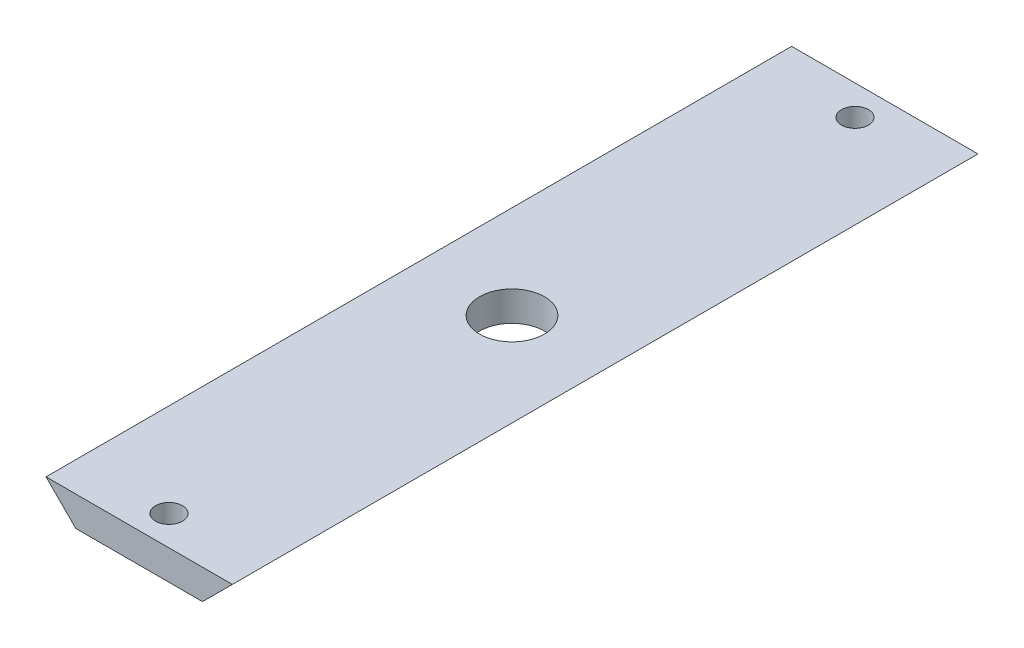
ISO-10303-21;
HEADER;
FILE_DESCRIPTION(('STEP AP214'),'2;1');
FILE_NAME('part.step','',(''),(''),'','','');
FILE_SCHEMA(('AUTOMOTIVE_DESIGN { 1 0 10303 214 1 1 1 1 }'));
ENDSEC;
DATA;
#1=APPLICATION_CONTEXT('core data for automotive mechanical design processes');
#2=APPLICATION_PROTOCOL_DEFINITION('international standard','automotive_design',2000,#1);
#3=PRODUCT_CONTEXT('',#1,'mechanical');
#4=PRODUCT('Part','Part','',(#3));
#5=PRODUCT_RELATED_PRODUCT_CATEGORY('part','',(#4));
#6=PRODUCT_DEFINITION_FORMATION('','',#4);
#7=PRODUCT_DEFINITION_CONTEXT('part definition',#1,'design');
#8=PRODUCT_DEFINITION('design','',#6,#7);
#9=PRODUCT_DEFINITION_SHAPE('','',#8);
#10=(LENGTH_UNIT() NAMED_UNIT(*) SI_UNIT(.MILLI.,.METRE.));
#11=(NAMED_UNIT(*) PLANE_ANGLE_UNIT() SI_UNIT($,.RADIAN.));
#12=(NAMED_UNIT(*) SI_UNIT($,.STERADIAN.) SOLID_ANGLE_UNIT());
#13=UNCERTAINTY_MEASURE_WITH_UNIT(LENGTH_MEASURE(1.E-05),#10,'distance_accuracy_value','');
#14=(GEOMETRIC_REPRESENTATION_CONTEXT(3) GLOBAL_UNCERTAINTY_ASSIGNED_CONTEXT((#13)) GLOBAL_UNIT_ASSIGNED_CONTEXT((#10,
#11,#12)) REPRESENTATION_CONTEXT('',''));
#15=CARTESIAN_POINT('',(0.,0.,0.));
#16=DIRECTION('',(0.,0.,1.));
#17=DIRECTION('',(1.,0.,0.));
#18=AXIS2_PLACEMENT_3D('',#15,#16,#17);
#19=CARTESIAN_POINT('',(6.7437,-3.175,39.6875));
#20=DIRECTION('',(0.,1.,0.));
#21=DIRECTION('',(0.,0.,1.));
#22=AXIS2_PLACEMENT_3D('',#19,#20,#21);
#23=PLANE('',#22);
#24=CARTESIAN_POINT('',(0.,-3.175,0.));
#25=DIRECTION('',(0.,1.,0.));
#26=DIRECTION('',(0.,0.,1.));
#27=AXIS2_PLACEMENT_3D('',#24,#25,#26);
#28=CIRCLE('',#27,3.4544);
#29=CARTESIAN_POINT('',(0.,-3.175,3.4544));
#30=VERTEX_POINT('',#29);
#31=EDGE_CURVE('E150',#30,#30,#28,.T.);
#32=ORIENTED_EDGE('',*,*,#31,.T.);
#33=EDGE_LOOP('',(#32));
#34=FACE_BOUND('',#33,.T.);
#35=CARTESIAN_POINT('',(0.,-3.175,36.5125));
#36=DIRECTION('',(0.,1.,0.));
#37=DIRECTION('',(-1.,0.,0.));
#38=AXIS2_PLACEMENT_3D('',#35,#36,#37);
#39=CIRCLE('',#38,1.4351);
#40=CARTESIAN_POINT('',(-1.4351,-3.175,36.5125));
#41=VERTEX_POINT('',#40);
#42=EDGE_CURVE('E101',#41,#41,#39,.T.);
#43=ORIENTED_EDGE('',*,*,#42,.T.);
#44=EDGE_LOOP('',(#43));
#45=FACE_BOUND('',#44,.T.);
#46=DIRECTION('',(0.,0.,-1.));
#47=VECTOR('',#46,1.);
#48=CARTESIAN_POINT('',(-6.7437,-3.175,39.6875));
#49=LINE('',#48,#47);
#50=CARTESIAN_POINT('',(-6.7437,-3.175,39.6875));
#51=VERTEX_POINT('',#50);
#52=CARTESIAN_POINT('',(-6.7437,-3.175,-39.6875));
#53=VERTEX_POINT('',#52);
#54=EDGE_CURVE('E72',#51,#53,#49,.T.);
#55=ORIENTED_EDGE('',*,*,#54,.T.);
#56=DIRECTION('',(1.,0.,0.));
#57=VECTOR('',#56,1.);
#58=CARTESIAN_POINT('',(6.7437,-3.175,-39.6875));
#59=LINE('',#58,#57);
#60=CARTESIAN_POINT('',(6.7437,-3.175,-39.6875));
#61=VERTEX_POINT('',#60);
#62=EDGE_CURVE('E76',#53,#61,#59,.T.);
#63=ORIENTED_EDGE('',*,*,#62,.T.);
#64=DIRECTION('',(0.,0.,-1.));
#65=VECTOR('',#64,1.);
#66=CARTESIAN_POINT('',(6.7437,-3.175,39.6875));
#67=LINE('',#66,#65);
#68=CARTESIAN_POINT('',(6.7437,-3.175,39.6875));
#69=VERTEX_POINT('',#68);
#70=EDGE_CURVE('E11',#69,#61,#67,.T.);
#71=ORIENTED_EDGE('',*,*,#70,.F.);
#72=DIRECTION('',(1.,0.,0.));
#73=VECTOR('',#72,1.);
#74=CARTESIAN_POINT('',(6.7437,-3.175,39.6875));
#75=LINE('',#74,#73);
#76=EDGE_CURVE('E53',#51,#69,#75,.T.);
#77=ORIENTED_EDGE('',*,*,#76,.F.);
#78=EDGE_LOOP('',(#55,#63,#71,#77));
#79=FACE_BOUND('',#78,.T.);
#80=CARTESIAN_POINT('',(0.,-3.175,-36.5125));
#81=DIRECTION('',(0.,-1.,0.));
#82=DIRECTION('',(-1.,0.,0.));
#83=AXIS2_PLACEMENT_3D('',#80,#81,#82);
#84=CIRCLE('',#83,1.4351);
#85=CARTESIAN_POINT('',(-1.4351,-3.175,-36.5125));
#86=VERTEX_POINT('',#85);
#87=EDGE_CURVE('E88',#86,#86,#84,.T.);
#88=ORIENTED_EDGE('',*,*,#87,.F.);
#89=EDGE_LOOP('',(#88));
#90=FACE_BOUND('',#89,.T.);
#91=ADVANCED_FACE('F34',(#34,#45,#79,#90),#23,.F.);
#92=CARTESIAN_POINT('',(9.91869999999999,0.,39.6875));
#93=DIRECTION('',(-0.707106781186549,0.707106781186546,0.));
#94=DIRECTION('',(-0.707106781186546,-0.707106781186549,0.));
#95=AXIS2_PLACEMENT_3D('',#92,#93,#94);
#96=PLANE('',#95);
#97=ORIENTED_EDGE('',*,*,#70,.T.);
#98=DIRECTION('',(0.707106781186546,0.707106781186549,0.));
#99=VECTOR('',#98,1.);
#100=CARTESIAN_POINT('',(9.91869999999999,0.,-39.6875));
#101=LINE('',#100,#99);
#102=CARTESIAN_POINT('',(9.91869999999999,0.,-39.6875));
#103=VERTEX_POINT('',#102);
#104=EDGE_CURVE('E93',#61,#103,#101,.T.);
#105=ORIENTED_EDGE('',*,*,#104,.T.);
#106=DIRECTION('',(0.,0.,-1.));
#107=VECTOR('',#106,1.);
#108=CARTESIAN_POINT('',(9.91869999999999,0.,39.6875));
#109=LINE('',#108,#107);
#110=CARTESIAN_POINT('',(9.91869999999999,0.,39.6875));
#111=VERTEX_POINT('',#110);
#112=EDGE_CURVE('E41',#111,#103,#109,.T.);
#113=ORIENTED_EDGE('',*,*,#112,.F.);
#114=DIRECTION('',(0.707106781186546,0.707106781186549,0.));
#115=VECTOR('',#114,1.);
#116=CARTESIAN_POINT('',(9.91869999999999,0.,39.6875));
#117=LINE('',#116,#115);
#118=EDGE_CURVE('E48',#69,#111,#117,.T.);
#119=ORIENTED_EDGE('',*,*,#118,.F.);
#120=EDGE_LOOP('',(#97,#105,#113,#119));
#121=FACE_BOUND('',#120,.T.);
#122=ADVANCED_FACE('F117',(#121),#96,.F.);
#123=CARTESIAN_POINT('',(0.,0.,39.6875));
#124=DIRECTION('',(0.,-1.,0.));
#125=DIRECTION('',(1.,0.,0.));
#126=AXIS2_PLACEMENT_3D('',#123,#124,#125);
#127=PLANE('',#126);
#128=CARTESIAN_POINT('',(0.,0.,0.));
#129=DIRECTION('',(0.,1.,0.));
#130=DIRECTION('',(0.,0.,1.));
#131=AXIS2_PLACEMENT_3D('',#128,#129,#130);
#132=CIRCLE('',#131,3.45439999999999);
#133=CARTESIAN_POINT('',(0.,0.,3.45439999999999));
#134=VERTEX_POINT('',#133);
#135=EDGE_CURVE('E153',#134,#134,#132,.T.);
#136=ORIENTED_EDGE('',*,*,#135,.F.);
#137=EDGE_LOOP('',(#136));
#138=FACE_BOUND('',#137,.T.);
#139=CARTESIAN_POINT('',(0.,0.,36.5125));
#140=DIRECTION('',(0.,1.,0.));
#141=DIRECTION('',(-1.,0.,0.));
#142=AXIS2_PLACEMENT_3D('',#139,#140,#141);
#143=CIRCLE('',#142,1.4351);
#144=CARTESIAN_POINT('',(-1.4351,0.,36.5125));
#145=VERTEX_POINT('',#144);
#146=EDGE_CURVE('E100',#145,#145,#143,.T.);
#147=ORIENTED_EDGE('',*,*,#146,.F.);
#148=EDGE_LOOP('',(#147));
#149=FACE_BOUND('',#148,.T.);
#150=ORIENTED_EDGE('',*,*,#112,.T.);
#151=DIRECTION('',(-1.,0.,0.));
#152=VECTOR('',#151,1.);
#153=CARTESIAN_POINT('',(0.,0.,-39.6875));
#154=LINE('',#153,#152);
#155=CARTESIAN_POINT('',(-9.91869999999999,0.,-39.6875));
#156=VERTEX_POINT('',#155);
#157=EDGE_CURVE('E95',#103,#156,#154,.T.);
#158=ORIENTED_EDGE('',*,*,#157,.T.);
#159=DIRECTION('',(0.,0.,-1.));
#160=VECTOR('',#159,1.);
#161=CARTESIAN_POINT('',(-9.91869999999999,0.,39.6875));
#162=LINE('',#161,#160);
#163=CARTESIAN_POINT('',(-9.91869999999999,0.,39.6875));
#164=VERTEX_POINT('',#163);
#165=EDGE_CURVE('E79',#164,#156,#162,.T.);
#166=ORIENTED_EDGE('',*,*,#165,.F.);
#167=DIRECTION('',(-1.,0.,0.));
#168=VECTOR('',#167,1.);
#169=CARTESIAN_POINT('',(0.,0.,39.6875));
#170=LINE('',#169,#168);
#171=EDGE_CURVE('E111',#111,#164,#170,.T.);
#172=ORIENTED_EDGE('',*,*,#171,.F.);
#173=EDGE_LOOP('',(#150,#158,#166,#172));
#174=FACE_BOUND('',#173,.T.);
#175=CARTESIAN_POINT('',(0.,0.,-36.5125));
#176=DIRECTION('',(0.,-1.,0.));
#177=DIRECTION('',(-1.,0.,0.));
#178=AXIS2_PLACEMENT_3D('',#175,#176,#177);
#179=CIRCLE('',#178,1.4351);
#180=CARTESIAN_POINT('',(-1.4351,0.,-36.5125));
#181=VERTEX_POINT('',#180);
#182=EDGE_CURVE('E155',#181,#181,#179,.T.);
#183=ORIENTED_EDGE('',*,*,#182,.T.);
#184=EDGE_LOOP('',(#183));
#185=FACE_BOUND('',#184,.T.);
#186=ADVANCED_FACE('F114',(#138,#149,#174,#185),#127,.F.);
#187=CARTESIAN_POINT('',(0.,0.,39.6875));
#188=DIRECTION('',(0.,0.,-1.));
#189=DIRECTION('',(-1.,0.,0.));
#190=AXIS2_PLACEMENT_3D('',#187,#188,#189);
#191=PLANE('',#190);
#192=ORIENTED_EDGE('',*,*,#171,.T.);
#193=DIRECTION('',(-0.707106781186546,0.707106781186549,0.));
#194=VECTOR('',#193,1.);
#195=CARTESIAN_POINT('',(-9.91869999999999,0.,39.6875));
#196=LINE('',#195,#194);
#197=EDGE_CURVE('E104',#51,#164,#196,.T.);
#198=ORIENTED_EDGE('',*,*,#197,.F.);
#199=ORIENTED_EDGE('',*,*,#76,.T.);
#200=ORIENTED_EDGE('',*,*,#118,.T.);
#201=EDGE_LOOP('',(#192,#198,#199,#200));
#202=FACE_BOUND('',#201,.T.);
#203=ADVANCED_FACE('F123',(#202),#191,.F.);
#204=CARTESIAN_POINT('',(-9.91869999999999,0.,39.6875));
#205=DIRECTION('',(0.707106781186549,0.707106781186546,0.));
#206=DIRECTION('',(0.707106781186546,-0.707106781186549,0.));
#207=AXIS2_PLACEMENT_3D('',#204,#205,#206);
#208=PLANE('',#207);
#209=ORIENTED_EDGE('',*,*,#165,.T.);
#210=DIRECTION('',(-0.707106781186546,0.707106781186549,0.));
#211=VECTOR('',#210,1.);
#212=CARTESIAN_POINT('',(-9.91869999999999,0.,-39.6875));
#213=LINE('',#212,#211);
#214=EDGE_CURVE('E82',#53,#156,#213,.T.);
#215=ORIENTED_EDGE('',*,*,#214,.F.);
#216=ORIENTED_EDGE('',*,*,#54,.F.);
#217=ORIENTED_EDGE('',*,*,#197,.T.);
#218=EDGE_LOOP('',(#209,#215,#216,#217));
#219=FACE_BOUND('',#218,.T.);
#220=ADVANCED_FACE('F83',(#219),#208,.F.);
#221=CARTESIAN_POINT('',(0.,-3.175,36.5125));
#222=DIRECTION('',(0.,1.,0.));
#223=DIRECTION('',(-1.,0.,0.));
#224=AXIS2_PLACEMENT_3D('',#221,#222,#223);
#225=CYLINDRICAL_SURFACE('',#224,1.4351);
#226=ORIENTED_EDGE('',*,*,#42,.F.);
#227=EDGE_LOOP('',(#226));
#228=FACE_BOUND('',#227,.T.);
#229=ORIENTED_EDGE('',*,*,#146,.T.);
#230=EDGE_LOOP('',(#229));
#231=FACE_BOUND('',#230,.T.);
#232=ADVANCED_FACE('F132',(#228,#231),#225,.F.);
#233=CARTESIAN_POINT('',(0.,0.,-39.6875));
#234=DIRECTION('',(0.,0.,1.));
#235=DIRECTION('',(-1.,0.,0.));
#236=AXIS2_PLACEMENT_3D('',#233,#234,#235);
#237=PLANE('',#236);
#238=ORIENTED_EDGE('',*,*,#157,.F.);
#239=ORIENTED_EDGE('',*,*,#104,.F.);
#240=ORIENTED_EDGE('',*,*,#62,.F.);
#241=ORIENTED_EDGE('',*,*,#214,.T.);
#242=EDGE_LOOP('',(#238,#239,#240,#241));
#243=FACE_BOUND('',#242,.T.);
#244=ADVANCED_FACE('F91',(#243),#237,.F.);
#245=CARTESIAN_POINT('',(0.,-3.175,-36.5125));
#246=DIRECTION('',(0.,1.,0.));
#247=DIRECTION('',(-1.,0.,0.));
#248=AXIS2_PLACEMENT_3D('',#245,#246,#247);
#249=CYLINDRICAL_SURFACE('',#248,1.4351);
#250=ORIENTED_EDGE('',*,*,#87,.T.);
#251=EDGE_LOOP('',(#250));
#252=FACE_BOUND('',#251,.T.);
#253=ORIENTED_EDGE('',*,*,#182,.F.);
#254=EDGE_LOOP('',(#253));
#255=FACE_BOUND('',#254,.T.);
#256=ADVANCED_FACE('F138',(#252,#255),#249,.F.);
#257=CARTESIAN_POINT('',(0.,0.,0.));
#258=DIRECTION('',(0.,1.,0.));
#259=DIRECTION('',(0.,0.,1.));
#260=AXIS2_PLACEMENT_3D('',#257,#258,#259);
#261=CYLINDRICAL_SURFACE('',#260,3.45439999999999);
#262=ORIENTED_EDGE('',*,*,#31,.F.);
#263=EDGE_LOOP('',(#262));
#264=FACE_BOUND('',#263,.T.);
#265=ORIENTED_EDGE('',*,*,#135,.T.);
#266=EDGE_LOOP('',(#265));
#267=FACE_BOUND('',#266,.T.);
#268=ADVANCED_FACE('F141',(#264,#267),#261,.F.);
#269=CLOSED_SHELL('',(#91,#122,#186,#203,#220,#232,#244,#256,#268));
#270=MANIFOLD_SOLID_BREP('B2',#269);
#271=ADVANCED_BREP_SHAPE_REPRESENTATION('',(#18,#270),#14);
#272=SHAPE_DEFINITION_REPRESENTATION(#9,#271);
ENDSEC;
END-ISO-10303-21;
